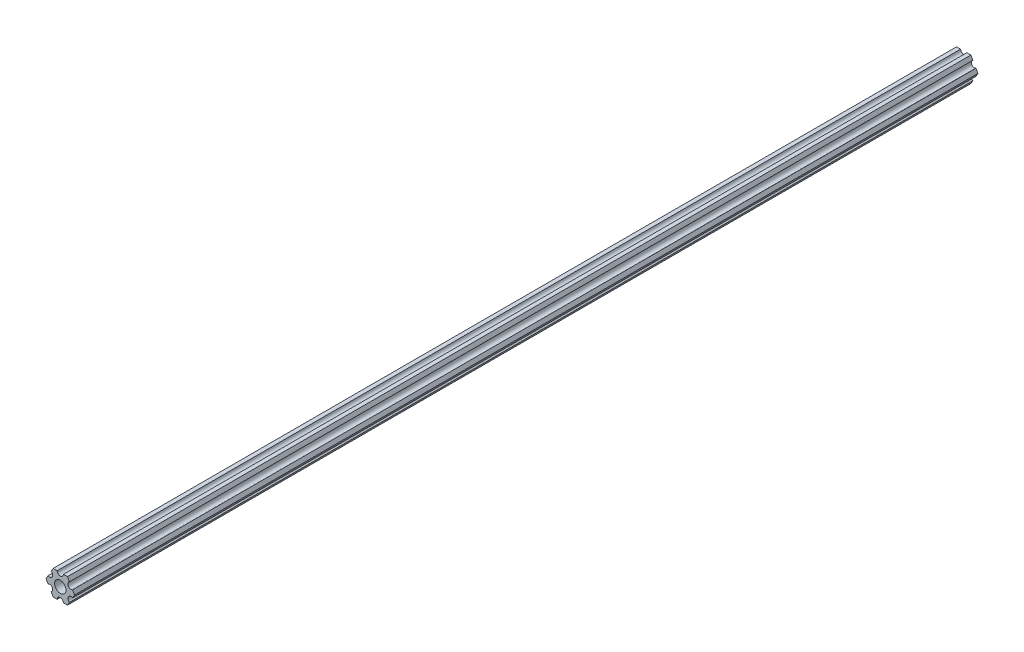
ISO-10303-21;
HEADER;
FILE_DESCRIPTION(('STEP AP214'),'2;1');
FILE_NAME('part.step','',(''),(''),'','','');
FILE_SCHEMA(('AUTOMOTIVE_DESIGN { 1 0 10303 214 1 1 1 1 }'));
ENDSEC;
DATA;
#1=APPLICATION_CONTEXT('core data for automotive mechanical design processes');
#2=APPLICATION_PROTOCOL_DEFINITION('international standard','automotive_design',2000,#1);
#3=PRODUCT_CONTEXT('',#1,'mechanical');
#4=PRODUCT('Part','Part','',(#3));
#5=PRODUCT_RELATED_PRODUCT_CATEGORY('part','',(#4));
#6=PRODUCT_DEFINITION_FORMATION('','',#4);
#7=PRODUCT_DEFINITION_CONTEXT('part definition',#1,'design');
#8=PRODUCT_DEFINITION('design','',#6,#7);
#9=PRODUCT_DEFINITION_SHAPE('','',#8);
#10=(LENGTH_UNIT() NAMED_UNIT(*) SI_UNIT(.MILLI.,.METRE.));
#11=(NAMED_UNIT(*) PLANE_ANGLE_UNIT() SI_UNIT($,.RADIAN.));
#12=(NAMED_UNIT(*) SI_UNIT($,.STERADIAN.) SOLID_ANGLE_UNIT());
#13=UNCERTAINTY_MEASURE_WITH_UNIT(LENGTH_MEASURE(1.E-05),#10,'distance_accuracy_value','');
#14=(GEOMETRIC_REPRESENTATION_CONTEXT(3) GLOBAL_UNCERTAINTY_ASSIGNED_CONTEXT((#13)) GLOBAL_UNIT_ASSIGNED_CONTEXT((#10,
#11,#12)) REPRESENTATION_CONTEXT('',''));
#15=CARTESIAN_POINT('',(0.,0.,0.));
#16=DIRECTION('',(0.,0.,1.));
#17=DIRECTION('',(1.,0.,0.));
#18=AXIS2_PLACEMENT_3D('',#15,#16,#17);
#19=CARTESIAN_POINT('',(5.49926112168156,3.17500033315933,231.775));
#20=DIRECTION('',(0.,0.,1.));
#21=DIRECTION('',(1.,0.,0.));
#22=AXIS2_PLACEMENT_3D('',#19,#20,#21);
#23=PLANE('',#22);
#24=DIRECTION('',(0.499999947533953,0.866025434075723,0.));
#25=VECTOR('',#24,1.);
#26=CARTESIAN_POINT('',(6.29301142309098,-1.80018429024546,231.775));
#27=LINE('',#26,#25);
#28=CARTESIAN_POINT('',(6.29301142309098,-1.80018429024546,231.775));
#29=VERTEX_POINT('',#28);
#30=CARTESIAN_POINT('',(7.33234841870826,4.44212519169686E-07,231.775));
#31=VERTEX_POINT('',#30);
#32=EDGE_CURVE('E256',#29,#31,#27,.T.);
#33=ORIENTED_EDGE('',*,*,#32,.T.);
#34=DIRECTION('',(-0.500000052466056,0.866025373493145,0.));
#35=VECTOR('',#34,1.);
#36=CARTESIAN_POINT('',(7.33234841870826,4.44212519169686E-07,231.775));
#37=LINE('',#36,#35);
#38=CARTESIAN_POINT('',(6.29301120497139,1.80018505273894,231.775));
#39=VERTEX_POINT('',#38);
#40=EDGE_CURVE('E132',#31,#39,#37,.T.);
#41=ORIENTED_EDGE('',*,*,#40,.T.);
#42=CARTESIAN_POINT('',(5.49926112168156,3.17500033315933,231.775));
#43=DIRECTION('',(0.,0.,-1.));
#44=DIRECTION('',(1.,0.,0.));
#45=AXIS2_PLACEMENT_3D('',#42,#43,#44);
#46=CIRCLE('',#45,1.5875);
#47=CARTESIAN_POINT('',(4.70551103839172,4.54981561357972,231.775));
#48=VERTEX_POINT('',#47);
#49=EDGE_CURVE('E317',#39,#48,#46,.T.);
#50=ORIENTED_EDGE('',*,*,#49,.T.);
#51=DIRECTION('',(-0.500000052466046,0.866025373493151,0.));
#52=VECTOR('',#51,1.);
#53=CARTESIAN_POINT('',(4.70551103839172,4.54981561357972,231.775));
#54=LINE('',#53,#52);
#55=CARTESIAN_POINT('',(3.66617382465481,6.35000022210627,231.775));
#56=VERTEX_POINT('',#55);
#57=EDGE_CURVE('E337',#48,#56,#54,.T.);
#58=ORIENTED_EDGE('',*,*,#57,.T.);
#59=DIRECTION('',(-0.999999999999998,-6.05825850611185E-08,0.));
#60=VECTOR('',#59,1.);
#61=CARTESIAN_POINT('',(3.66617382465481,6.35000022210627,231.775));
#62=LINE('',#61,#60);
#63=CARTESIAN_POINT('',(1.58749961530074,6.35000009617482,231.775));
#64=VERTEX_POINT('',#63);
#65=EDGE_CURVE('E333',#56,#64,#62,.T.);
#66=ORIENTED_EDGE('',*,*,#65,.T.);
#67=CARTESIAN_POINT('',(-3.84699260060323E-07,6.35,231.775));
#68=DIRECTION('',(0.,0.,-1.));
#69=DIRECTION('',(1.,0.,0.));
#70=AXIS2_PLACEMENT_3D('',#67,#68,#69);
#71=CIRCLE('',#70,1.5875);
#72=CARTESIAN_POINT('',(-1.58750038469926,6.34999990382518,231.775));
#73=VERTEX_POINT('',#72);
#74=EDGE_CURVE('E336',#64,#73,#71,.T.);
#75=ORIENTED_EDGE('',*,*,#74,.T.);
#76=DIRECTION('',(-0.999999999999998,-6.05825963273174E-08,0.));
#77=VECTOR('',#76,1.);
#78=CARTESIAN_POINT('',(-1.58750038469926,6.34999990382518,231.775));
#79=LINE('',#78,#77);
#80=CARTESIAN_POINT('',(-3.66617459405349,6.3499997778937,231.775));
#81=VERTEX_POINT('',#80);
#82=EDGE_CURVE('E341',#73,#81,#79,.T.);
#83=ORIENTED_EDGE('',*,*,#82,.T.);
#84=DIRECTION('',(-0.499999947533942,-0.866025434075729,0.));
#85=VECTOR('',#84,1.);
#86=CARTESIAN_POINT('',(-3.66617459405349,6.3499997778937,231.775));
#87=LINE('',#86,#85);
#88=CARTESIAN_POINT('',(-4.70551158967065,4.54981504343587,231.775));
#89=VERTEX_POINT('',#88);
#90=EDGE_CURVE('E348',#81,#89,#87,.T.);
#91=ORIENTED_EDGE('',*,*,#90,.T.);
#92=CARTESIAN_POINT('',(-5.49926150638082,3.17499966684067,231.775));
#93=DIRECTION('',(0.,0.,-1.));
#94=DIRECTION('',(1.,0.,0.));
#95=AXIS2_PLACEMENT_3D('',#92,#93,#94);
#96=CIRCLE('',#95,1.5875);
#97=CARTESIAN_POINT('',(-6.29301142309098,1.80018429024547,231.775));
#98=VERTEX_POINT('',#97);
#99=EDGE_CURVE('E351',#89,#98,#96,.T.);
#100=ORIENTED_EDGE('',*,*,#99,.T.);
#101=DIRECTION('',(-0.499999947533951,-0.866025434075724,0.));
#102=VECTOR('',#101,1.);
#103=CARTESIAN_POINT('',(-6.29301142309098,1.80018429024547,231.775));
#104=LINE('',#103,#102);
#105=CARTESIAN_POINT('',(-7.33234841870826,-4.44212523790841E-07,231.775));
#106=VERTEX_POINT('',#105);
#107=EDGE_CURVE('E354',#98,#106,#104,.T.);
#108=ORIENTED_EDGE('',*,*,#107,.T.);
#109=DIRECTION('',(0.500000052466045,-0.866025373493151,0.));
#110=VECTOR('',#109,1.);
#111=CARTESIAN_POINT('',(-7.33234841870826,-4.44212523790841E-07,231.775));
#112=LINE('',#111,#110);
#113=CARTESIAN_POINT('',(-6.29301120497141,-1.80018505273897,231.775));
#114=VERTEX_POINT('',#113);
#115=EDGE_CURVE('E357',#106,#114,#112,.T.);
#116=ORIENTED_EDGE('',*,*,#115,.T.);
#117=CARTESIAN_POINT('',(-5.49926112168156,-3.17500033315934,231.775));
#118=DIRECTION('',(0.,0.,-1.));
#119=DIRECTION('',(1.,0.,0.));
#120=AXIS2_PLACEMENT_3D('',#117,#118,#119);
#121=CIRCLE('',#120,1.5875);
#122=CARTESIAN_POINT('',(-4.70551103839172,-4.54981561357972,231.775));
#123=VERTEX_POINT('',#122);
#124=EDGE_CURVE('E360',#114,#123,#121,.T.);
#125=ORIENTED_EDGE('',*,*,#124,.T.);
#126=DIRECTION('',(0.500000052466045,-0.866025373493151,0.));
#127=VECTOR('',#126,1.);
#128=CARTESIAN_POINT('',(-4.70551103839172,-4.54981561357972,231.775));
#129=LINE('',#128,#127);
#130=CARTESIAN_POINT('',(-3.66617382465481,-6.35000022210628,231.775));
#131=VERTEX_POINT('',#130);
#132=EDGE_CURVE('E363',#123,#131,#129,.T.);
#133=ORIENTED_EDGE('',*,*,#132,.T.);
#134=DIRECTION('',(0.999999999999998,6.05825854783851E-08,0.));
#135=VECTOR('',#134,1.);
#136=CARTESIAN_POINT('',(-3.66617382465481,-6.35000022210628,231.775));
#137=LINE('',#136,#135);
#138=CARTESIAN_POINT('',(-1.58749961530074,-6.35000009617482,231.775));
#139=VERTEX_POINT('',#138);
#140=EDGE_CURVE('E366',#131,#139,#137,.T.);
#141=ORIENTED_EDGE('',*,*,#140,.T.);
#142=CARTESIAN_POINT('',(3.8469926204343E-07,-6.35,231.775));
#143=DIRECTION('',(0.,0.,-1.));
#144=DIRECTION('',(1.,0.,0.));
#145=AXIS2_PLACEMENT_3D('',#142,#143,#144);
#146=CIRCLE('',#145,1.5875);
#147=CARTESIAN_POINT('',(1.58750038469926,-6.34999990382518,231.775));
#148=VERTEX_POINT('',#147);
#149=EDGE_CURVE('E181',#139,#148,#146,.T.);
#150=ORIENTED_EDGE('',*,*,#149,.T.);
#151=DIRECTION('',(0.999999999999998,6.05825721258438E-08,0.));
#152=VECTOR('',#151,1.);
#153=CARTESIAN_POINT('',(1.58750038469926,-6.34999990382518,231.775));
#154=LINE('',#153,#152);
#155=CARTESIAN_POINT('',(3.66617459405346,-6.34999977789375,231.775));
#156=VERTEX_POINT('',#155);
#157=EDGE_CURVE('E175',#148,#156,#154,.T.);
#158=ORIENTED_EDGE('',*,*,#157,.T.);
#159=DIRECTION('',(0.499999947533941,0.86602543407573,0.));
#160=VECTOR('',#159,1.);
#161=CARTESIAN_POINT('',(3.66617459405346,-6.34999977789375,231.775));
#162=LINE('',#161,#160);
#163=CARTESIAN_POINT('',(4.70551158967065,-4.54981504343587,231.775));
#164=VERTEX_POINT('',#163);
#165=EDGE_CURVE('E179',#156,#164,#162,.T.);
#166=ORIENTED_EDGE('',*,*,#165,.T.);
#167=CARTESIAN_POINT('',(5.49926150638082,-3.17499966684067,231.775));
#168=DIRECTION('',(0.,0.,-1.));
#169=DIRECTION('',(1.,0.,0.));
#170=AXIS2_PLACEMENT_3D('',#167,#168,#169);
#171=CIRCLE('',#170,1.58750000000001);
#172=EDGE_CURVE('E59',#164,#29,#171,.T.);
#173=ORIENTED_EDGE('',*,*,#172,.T.);
#174=EDGE_LOOP('',(#33,#41,#50,#58,#66,#75,#83,#91,#100,#108,#116,#125,#133,#141,#150,#158,#166,#173));
#175=FACE_BOUND('',#174,.T.);
#176=CARTESIAN_POINT('',(0.,0.,231.775));
#177=DIRECTION('',(0.,0.,1.));
#178=DIRECTION('',(1.,0.,0.));
#179=AXIS2_PLACEMENT_3D('',#176,#177,#178);
#180=CIRCLE('',#179,2.9337);
#181=CARTESIAN_POINT('',(2.9337,0.,231.775));
#182=VERTEX_POINT('',#181);
#183=EDGE_CURVE('E208',#182,#182,#180,.T.);
#184=ORIENTED_EDGE('',*,*,#183,.F.);
#185=EDGE_LOOP('',(#184));
#186=FACE_BOUND('',#185,.T.);
#187=ADVANCED_FACE('F41',(#175,#186),#23,.T.);
#188=CARTESIAN_POINT('',(5.49926112168156,3.17500033315933,-231.775));
#189=DIRECTION('',(0.,0.,1.));
#190=DIRECTION('',(1.,0.,0.));
#191=AXIS2_PLACEMENT_3D('',#188,#189,#190);
#192=PLANE('',#191);
#193=DIRECTION('',(0.499999947533953,0.866025434075723,0.));
#194=VECTOR('',#193,1.);
#195=CARTESIAN_POINT('',(6.29301142309098,-1.80018429024546,-231.775));
#196=LINE('',#195,#194);
#197=CARTESIAN_POINT('',(6.29301142309098,-1.80018429024546,-231.775));
#198=VERTEX_POINT('',#197);
#199=CARTESIAN_POINT('',(7.33234841870826,4.44212519169686E-07,-231.775));
#200=VERTEX_POINT('',#199);
#201=EDGE_CURVE('E203',#198,#200,#196,.T.);
#202=ORIENTED_EDGE('',*,*,#201,.F.);
#203=CARTESIAN_POINT('',(5.49926150638082,-3.17499966684067,-231.775));
#204=DIRECTION('',(0.,0.,-1.));
#205=DIRECTION('',(1.,0.,0.));
#206=AXIS2_PLACEMENT_3D('',#203,#204,#205);
#207=CIRCLE('',#206,1.58750000000001);
#208=CARTESIAN_POINT('',(4.70551158967065,-4.54981504343587,-231.775));
#209=VERTEX_POINT('',#208);
#210=EDGE_CURVE('E124',#209,#198,#207,.T.);
#211=ORIENTED_EDGE('',*,*,#210,.F.);
#212=DIRECTION('',(0.499999947533941,0.86602543407573,0.));
#213=VECTOR('',#212,1.);
#214=CARTESIAN_POINT('',(3.66617459405346,-6.34999977789375,-231.775));
#215=LINE('',#214,#213);
#216=CARTESIAN_POINT('',(3.66617459405346,-6.34999977789375,-231.775));
#217=VERTEX_POINT('',#216);
#218=EDGE_CURVE('E118',#217,#209,#215,.T.);
#219=ORIENTED_EDGE('',*,*,#218,.F.);
#220=DIRECTION('',(0.999999999999998,6.05825721258438E-08,0.));
#221=VECTOR('',#220,1.);
#222=CARTESIAN_POINT('',(1.58750038469926,-6.34999990382518,-231.775));
#223=LINE('',#222,#221);
#224=CARTESIAN_POINT('',(1.58750038469926,-6.34999990382518,-231.775));
#225=VERTEX_POINT('',#224);
#226=EDGE_CURVE('E190',#225,#217,#223,.T.);
#227=ORIENTED_EDGE('',*,*,#226,.F.);
#228=CARTESIAN_POINT('',(3.8469926204343E-07,-6.35,-231.775));
#229=DIRECTION('',(0.,0.,-1.));
#230=DIRECTION('',(1.,0.,0.));
#231=AXIS2_PLACEMENT_3D('',#228,#229,#230);
#232=CIRCLE('',#231,1.5875);
#233=CARTESIAN_POINT('',(-1.58749961530074,-6.35000009617482,-231.775));
#234=VERTEX_POINT('',#233);
#235=EDGE_CURVE('E247',#234,#225,#232,.T.);
#236=ORIENTED_EDGE('',*,*,#235,.F.);
#237=DIRECTION('',(0.999999999999998,6.05825854783851E-08,0.));
#238=VECTOR('',#237,1.);
#239=CARTESIAN_POINT('',(-3.66617382465481,-6.35000022210628,-231.775));
#240=LINE('',#239,#238);
#241=CARTESIAN_POINT('',(-3.66617382465481,-6.35000022210628,-231.775));
#242=VERTEX_POINT('',#241);
#243=EDGE_CURVE('E244',#242,#234,#240,.T.);
#244=ORIENTED_EDGE('',*,*,#243,.F.);
#245=DIRECTION('',(0.500000052466045,-0.866025373493151,0.));
#246=VECTOR('',#245,1.);
#247=CARTESIAN_POINT('',(-4.70551103839172,-4.54981561357972,-231.775));
#248=LINE('',#247,#246);
#249=CARTESIAN_POINT('',(-4.70551103839172,-4.54981561357972,-231.775));
#250=VERTEX_POINT('',#249);
#251=EDGE_CURVE('E241',#250,#242,#248,.T.);
#252=ORIENTED_EDGE('',*,*,#251,.F.);
#253=CARTESIAN_POINT('',(-5.49926112168156,-3.17500033315934,-231.775));
#254=DIRECTION('',(0.,0.,-1.));
#255=DIRECTION('',(1.,0.,0.));
#256=AXIS2_PLACEMENT_3D('',#253,#254,#255);
#257=CIRCLE('',#256,1.5875);
#258=CARTESIAN_POINT('',(-6.29301120497141,-1.80018505273897,-231.775));
#259=VERTEX_POINT('',#258);
#260=EDGE_CURVE('E238',#259,#250,#257,.T.);
#261=ORIENTED_EDGE('',*,*,#260,.F.);
#262=DIRECTION('',(0.500000052466045,-0.866025373493151,0.));
#263=VECTOR('',#262,1.);
#264=CARTESIAN_POINT('',(-7.33234841870826,-4.44212523790841E-07,-231.775));
#265=LINE('',#264,#263);
#266=CARTESIAN_POINT('',(-7.33234841870826,-4.44212523790841E-07,-231.775));
#267=VERTEX_POINT('',#266);
#268=EDGE_CURVE('E235',#267,#259,#265,.T.);
#269=ORIENTED_EDGE('',*,*,#268,.F.);
#270=DIRECTION('',(-0.499999947533951,-0.866025434075724,0.));
#271=VECTOR('',#270,1.);
#272=CARTESIAN_POINT('',(-6.29301142309098,1.80018429024547,-231.775));
#273=LINE('',#272,#271);
#274=CARTESIAN_POINT('',(-6.29301142309098,1.80018429024547,-231.775));
#275=VERTEX_POINT('',#274);
#276=EDGE_CURVE('E232',#275,#267,#273,.T.);
#277=ORIENTED_EDGE('',*,*,#276,.F.);
#278=CARTESIAN_POINT('',(-5.49926150638082,3.17499966684067,-231.775));
#279=DIRECTION('',(0.,0.,-1.));
#280=DIRECTION('',(1.,0.,0.));
#281=AXIS2_PLACEMENT_3D('',#278,#279,#280);
#282=CIRCLE('',#281,1.5875);
#283=CARTESIAN_POINT('',(-4.70551158967065,4.54981504343587,-231.775));
#284=VERTEX_POINT('',#283);
#285=EDGE_CURVE('E229',#284,#275,#282,.T.);
#286=ORIENTED_EDGE('',*,*,#285,.F.);
#287=DIRECTION('',(-0.499999947533942,-0.866025434075729,0.));
#288=VECTOR('',#287,1.);
#289=CARTESIAN_POINT('',(-3.66617459405349,6.3499997778937,-231.775));
#290=LINE('',#289,#288);
#291=CARTESIAN_POINT('',(-3.66617459405349,6.3499997778937,-231.775));
#292=VERTEX_POINT('',#291);
#293=EDGE_CURVE('E226',#292,#284,#290,.T.);
#294=ORIENTED_EDGE('',*,*,#293,.F.);
#295=DIRECTION('',(-0.999999999999998,-6.05825963273174E-08,0.));
#296=VECTOR('',#295,1.);
#297=CARTESIAN_POINT('',(-1.58750038469926,6.34999990382518,-231.775));
#298=LINE('',#297,#296);
#299=CARTESIAN_POINT('',(-1.58750038469926,6.34999990382518,-231.775));
#300=VERTEX_POINT('',#299);
#301=EDGE_CURVE('E223',#300,#292,#298,.T.);
#302=ORIENTED_EDGE('',*,*,#301,.F.);
#303=CARTESIAN_POINT('',(-3.84699260060323E-07,6.35,-231.775));
#304=DIRECTION('',(0.,0.,-1.));
#305=DIRECTION('',(1.,0.,0.));
#306=AXIS2_PLACEMENT_3D('',#303,#304,#305);
#307=CIRCLE('',#306,1.5875);
#308=CARTESIAN_POINT('',(1.58749961530074,6.35000009617482,-231.775));
#309=VERTEX_POINT('',#308);
#310=EDGE_CURVE('E220',#309,#300,#307,.T.);
#311=ORIENTED_EDGE('',*,*,#310,.F.);
#312=DIRECTION('',(-0.999999999999998,-6.05825850611185E-08,0.));
#313=VECTOR('',#312,1.);
#314=CARTESIAN_POINT('',(3.66617382465481,6.35000022210627,-231.775));
#315=LINE('',#314,#313);
#316=CARTESIAN_POINT('',(3.66617382465481,6.35000022210627,-231.775));
#317=VERTEX_POINT('',#316);
#318=EDGE_CURVE('E217',#317,#309,#315,.T.);
#319=ORIENTED_EDGE('',*,*,#318,.F.);
#320=DIRECTION('',(-0.500000052466046,0.866025373493151,0.));
#321=VECTOR('',#320,1.);
#322=CARTESIAN_POINT('',(4.70551103839172,4.54981561357972,-231.775));
#323=LINE('',#322,#321);
#324=CARTESIAN_POINT('',(4.70551103839172,4.54981561357972,-231.775));
#325=VERTEX_POINT('',#324);
#326=EDGE_CURVE('E214',#325,#317,#323,.T.);
#327=ORIENTED_EDGE('',*,*,#326,.F.);
#328=CARTESIAN_POINT('',(5.49926112168156,3.17500033315933,-231.775));
#329=DIRECTION('',(0.,0.,-1.));
#330=DIRECTION('',(1.,0.,0.));
#331=AXIS2_PLACEMENT_3D('',#328,#329,#330);
#332=CIRCLE('',#331,1.5875);
#333=CARTESIAN_POINT('',(6.29301120497139,1.80018505273894,-231.775));
#334=VERTEX_POINT('',#333);
#335=EDGE_CURVE('E211',#334,#325,#332,.T.);
#336=ORIENTED_EDGE('',*,*,#335,.F.);
#337=DIRECTION('',(-0.500000052466056,0.866025373493145,0.));
#338=VECTOR('',#337,1.);
#339=CARTESIAN_POINT('',(7.33234841870826,4.44212519169686E-07,-231.775));
#340=LINE('',#339,#338);
#341=EDGE_CURVE('E207',#200,#334,#340,.T.);
#342=ORIENTED_EDGE('',*,*,#341,.F.);
#343=EDGE_LOOP('',(#202,#211,#219,#227,#236,#244,#252,#261,#269,#277,#286,#294,#302,#311,#319,
#327,#336,#342));
#344=FACE_BOUND('',#343,.T.);
#345=CARTESIAN_POINT('',(0.,0.,-231.775));
#346=DIRECTION('',(0.,0.,1.));
#347=DIRECTION('',(1.,0.,0.));
#348=AXIS2_PLACEMENT_3D('',#345,#346,#347);
#349=CIRCLE('',#348,2.9337);
#350=CARTESIAN_POINT('',(2.9337,0.,-231.775));
#351=VERTEX_POINT('',#350);
#352=EDGE_CURVE('E593',#351,#351,#349,.T.);
#353=ORIENTED_EDGE('',*,*,#352,.T.);
#354=EDGE_LOOP('',(#353));
#355=FACE_BOUND('',#354,.T.);
#356=ADVANCED_FACE('F321',(#344,#355),#192,.F.);
#357=CARTESIAN_POINT('',(6.29301142309098,-1.80018429024546,231.775));
#358=DIRECTION('',(-0.866025434075723,0.499999947533953,0.));
#359=DIRECTION('',(-0.499999947533953,-0.866025434075723,0.));
#360=AXIS2_PLACEMENT_3D('',#357,#358,#359);
#361=PLANE('',#360);
#362=ORIENTED_EDGE('',*,*,#201,.T.);
#363=DIRECTION('',(0.,0.,-1.));
#364=VECTOR('',#363,1.);
#365=CARTESIAN_POINT('',(7.33234841870826,4.44212519169686E-07,231.775));
#366=LINE('',#365,#364);
#367=EDGE_CURVE('E11',#31,#200,#366,.T.);
#368=ORIENTED_EDGE('',*,*,#367,.F.);
#369=ORIENTED_EDGE('',*,*,#32,.F.);
#370=DIRECTION('',(0.,0.,-1.));
#371=VECTOR('',#370,1.);
#372=CARTESIAN_POINT('',(6.29301142309098,-1.80018429024546,231.775));
#373=LINE('',#372,#371);
#374=EDGE_CURVE('E199',#29,#198,#373,.T.);
#375=ORIENTED_EDGE('',*,*,#374,.T.);
#376=EDGE_LOOP('',(#362,#368,#369,#375));
#377=FACE_BOUND('',#376,.T.);
#378=ADVANCED_FACE('F43',(#377),#361,.F.);
#379=CARTESIAN_POINT('',(7.33234841870826,4.44212519169686E-07,231.775));
#380=DIRECTION('',(-0.866025373493145,-0.500000052466056,0.));
#381=DIRECTION('',(0.500000052466057,-0.866025373493145,0.));
#382=AXIS2_PLACEMENT_3D('',#379,#380,#381);
#383=PLANE('',#382);
#384=ORIENTED_EDGE('',*,*,#341,.T.);
#385=DIRECTION('',(0.,0.,-1.));
#386=VECTOR('',#385,1.);
#387=CARTESIAN_POINT('',(6.29301120497139,1.80018505273894,231.775));
#388=LINE('',#387,#386);
#389=EDGE_CURVE('E51',#39,#334,#388,.T.);
#390=ORIENTED_EDGE('',*,*,#389,.F.);
#391=ORIENTED_EDGE('',*,*,#40,.F.);
#392=ORIENTED_EDGE('',*,*,#367,.T.);
#393=EDGE_LOOP('',(#384,#390,#391,#392));
#394=FACE_BOUND('',#393,.T.);
#395=ADVANCED_FACE('F402',(#394),#383,.F.);
#396=CARTESIAN_POINT('',(5.49926112168156,3.17500033315933,231.775));
#397=DIRECTION('',(0.,0.,-1.));
#398=DIRECTION('',(-1.,0.,0.));
#399=AXIS2_PLACEMENT_3D('',#396,#397,#398);
#400=CYLINDRICAL_SURFACE('',#399,1.5875);
#401=ORIENTED_EDGE('',*,*,#335,.T.);
#402=DIRECTION('',(0.,0.,-1.));
#403=VECTOR('',#402,1.);
#404=CARTESIAN_POINT('',(4.70551103839172,4.54981561357972,231.775));
#405=LINE('',#404,#403);
#406=EDGE_CURVE('E307',#48,#325,#405,.T.);
#407=ORIENTED_EDGE('',*,*,#406,.F.);
#408=ORIENTED_EDGE('',*,*,#49,.F.);
#409=ORIENTED_EDGE('',*,*,#389,.T.);
#410=EDGE_LOOP('',(#401,#407,#408,#409));
#411=FACE_BOUND('',#410,.T.);
#412=ADVANCED_FACE('F315',(#411),#400,.F.);
#413=CARTESIAN_POINT('',(4.70551103839172,4.54981561357972,231.775));
#414=DIRECTION('',(-0.866025373493151,-0.500000052466046,0.));
#415=DIRECTION('',(0.500000052466046,-0.866025373493151,0.));
#416=AXIS2_PLACEMENT_3D('',#413,#414,#415);
#417=PLANE('',#416);
#418=ORIENTED_EDGE('',*,*,#326,.T.);
#419=DIRECTION('',(0.,0.,-1.));
#420=VECTOR('',#419,1.);
#421=CARTESIAN_POINT('',(3.66617382465481,6.35000022210627,231.775));
#422=LINE('',#421,#420);
#423=EDGE_CURVE('E303',#56,#317,#422,.T.);
#424=ORIENTED_EDGE('',*,*,#423,.F.);
#425=ORIENTED_EDGE('',*,*,#57,.F.);
#426=ORIENTED_EDGE('',*,*,#406,.T.);
#427=EDGE_LOOP('',(#418,#424,#425,#426));
#428=FACE_BOUND('',#427,.T.);
#429=ADVANCED_FACE('F327',(#428),#417,.F.);
#430=CARTESIAN_POINT('',(3.66617382465481,6.35000022210627,231.775));
#431=DIRECTION('',(6.05825850611185E-08,-0.999999999999998,0.));
#432=DIRECTION('',(0.999999999999998,6.05825850611185E-08,0.));
#433=AXIS2_PLACEMENT_3D('',#430,#431,#432);
#434=PLANE('',#433);
#435=ORIENTED_EDGE('',*,*,#318,.T.);
#436=DIRECTION('',(0.,0.,-1.));
#437=VECTOR('',#436,1.);
#438=CARTESIAN_POINT('',(1.58749961530074,6.35000009617482,231.775));
#439=LINE('',#438,#437);
#440=EDGE_CURVE('E299',#64,#309,#439,.T.);
#441=ORIENTED_EDGE('',*,*,#440,.F.);
#442=ORIENTED_EDGE('',*,*,#65,.F.);
#443=ORIENTED_EDGE('',*,*,#423,.T.);
#444=EDGE_LOOP('',(#435,#441,#442,#443));
#445=FACE_BOUND('',#444,.T.);
#446=ADVANCED_FACE('F331',(#445),#434,.F.);
#447=CARTESIAN_POINT('',(-3.84699260060323E-07,6.35,231.775));
#448=DIRECTION('',(0.,0.,-1.));
#449=DIRECTION('',(-1.,0.,0.));
#450=AXIS2_PLACEMENT_3D('',#447,#448,#449);
#451=CYLINDRICAL_SURFACE('',#450,1.5875);
#452=ORIENTED_EDGE('',*,*,#310,.T.);
#453=DIRECTION('',(0.,0.,-1.));
#454=VECTOR('',#453,1.);
#455=CARTESIAN_POINT('',(-1.58750038469926,6.34999990382518,231.775));
#456=LINE('',#455,#454);
#457=EDGE_CURVE('E295',#73,#300,#456,.T.);
#458=ORIENTED_EDGE('',*,*,#457,.F.);
#459=ORIENTED_EDGE('',*,*,#74,.F.);
#460=ORIENTED_EDGE('',*,*,#440,.T.);
#461=EDGE_LOOP('',(#452,#458,#459,#460));
#462=FACE_BOUND('',#461,.T.);
#463=ADVANCED_FACE('F415',(#462),#451,.F.);
#464=CARTESIAN_POINT('',(-1.58750038469926,6.34999990382518,231.775));
#465=DIRECTION('',(6.05825963273174E-08,-0.999999999999998,0.));
#466=DIRECTION('',(0.999999999999998,6.05825963273174E-08,0.));
#467=AXIS2_PLACEMENT_3D('',#464,#465,#466);
#468=PLANE('',#467);
#469=ORIENTED_EDGE('',*,*,#301,.T.);
#470=DIRECTION('',(0.,0.,-1.));
#471=VECTOR('',#470,1.);
#472=CARTESIAN_POINT('',(-3.66617459405349,6.3499997778937,231.775));
#473=LINE('',#472,#471);
#474=EDGE_CURVE('E291',#81,#292,#473,.T.);
#475=ORIENTED_EDGE('',*,*,#474,.F.);
#476=ORIENTED_EDGE('',*,*,#82,.F.);
#477=ORIENTED_EDGE('',*,*,#457,.T.);
#478=EDGE_LOOP('',(#469,#475,#476,#477));
#479=FACE_BOUND('',#478,.T.);
#480=ADVANCED_FACE('F418',(#479),#468,.F.);
#481=CARTESIAN_POINT('',(-3.66617459405349,6.3499997778937,231.775));
#482=DIRECTION('',(0.866025434075729,-0.499999947533943,0.));
#483=DIRECTION('',(0.499999947533943,0.866025434075729,0.));
#484=AXIS2_PLACEMENT_3D('',#481,#482,#483);
#485=PLANE('',#484);
#486=ORIENTED_EDGE('',*,*,#293,.T.);
#487=DIRECTION('',(0.,0.,-1.));
#488=VECTOR('',#487,1.);
#489=CARTESIAN_POINT('',(-4.70551158967065,4.54981504343587,231.775));
#490=LINE('',#489,#488);
#491=EDGE_CURVE('E287',#89,#284,#490,.T.);
#492=ORIENTED_EDGE('',*,*,#491,.F.);
#493=ORIENTED_EDGE('',*,*,#90,.F.);
#494=ORIENTED_EDGE('',*,*,#474,.T.);
#495=EDGE_LOOP('',(#486,#492,#493,#494));
#496=FACE_BOUND('',#495,.T.);
#497=ADVANCED_FACE('F422',(#496),#485,.F.);
#498=CARTESIAN_POINT('',(-5.49926150638082,3.17499966684067,231.775));
#499=DIRECTION('',(0.,0.,-1.));
#500=DIRECTION('',(-1.,0.,0.));
#501=AXIS2_PLACEMENT_3D('',#498,#499,#500);
#502=CYLINDRICAL_SURFACE('',#501,1.5875);
#503=ORIENTED_EDGE('',*,*,#285,.T.);
#504=DIRECTION('',(0.,0.,-1.));
#505=VECTOR('',#504,1.);
#506=CARTESIAN_POINT('',(-6.29301142309098,1.80018429024547,231.775));
#507=LINE('',#506,#505);
#508=EDGE_CURVE('E283',#98,#275,#507,.T.);
#509=ORIENTED_EDGE('',*,*,#508,.F.);
#510=ORIENTED_EDGE('',*,*,#99,.F.);
#511=ORIENTED_EDGE('',*,*,#491,.T.);
#512=EDGE_LOOP('',(#503,#509,#510,#511));
#513=FACE_BOUND('',#512,.T.);
#514=ADVANCED_FACE('F426',(#513),#502,.F.);
#515=CARTESIAN_POINT('',(-6.29301142309098,1.80018429024547,231.775));
#516=DIRECTION('',(0.866025434075724,-0.499999947533951,0.));
#517=DIRECTION('',(0.499999947533951,0.866025434075724,0.));
#518=AXIS2_PLACEMENT_3D('',#515,#516,#517);
#519=PLANE('',#518);
#520=ORIENTED_EDGE('',*,*,#276,.T.);
#521=DIRECTION('',(0.,0.,-1.));
#522=VECTOR('',#521,1.);
#523=CARTESIAN_POINT('',(-7.33234841870826,-4.44212523790841E-07,231.775));
#524=LINE('',#523,#522);
#525=EDGE_CURVE('E279',#106,#267,#524,.T.);
#526=ORIENTED_EDGE('',*,*,#525,.F.);
#527=ORIENTED_EDGE('',*,*,#107,.F.);
#528=ORIENTED_EDGE('',*,*,#508,.T.);
#529=EDGE_LOOP('',(#520,#526,#527,#528));
#530=FACE_BOUND('',#529,.T.);
#531=ADVANCED_FACE('F430',(#530),#519,.F.);
#532=CARTESIAN_POINT('',(-7.33234841870826,-4.44212523790841E-07,231.775));
#533=DIRECTION('',(0.866025373493151,0.500000052466045,0.));
#534=DIRECTION('',(-0.500000052466045,0.866025373493151,0.));
#535=AXIS2_PLACEMENT_3D('',#532,#533,#534);
#536=PLANE('',#535);
#537=ORIENTED_EDGE('',*,*,#268,.T.);
#538=DIRECTION('',(0.,0.,-1.));
#539=VECTOR('',#538,1.);
#540=CARTESIAN_POINT('',(-6.29301120497141,-1.80018505273897,231.775));
#541=LINE('',#540,#539);
#542=EDGE_CURVE('E275',#114,#259,#541,.T.);
#543=ORIENTED_EDGE('',*,*,#542,.F.);
#544=ORIENTED_EDGE('',*,*,#115,.F.);
#545=ORIENTED_EDGE('',*,*,#525,.T.);
#546=EDGE_LOOP('',(#537,#543,#544,#545));
#547=FACE_BOUND('',#546,.T.);
#548=ADVANCED_FACE('F434',(#547),#536,.F.);
#549=CARTESIAN_POINT('',(-5.49926112168156,-3.17500033315934,231.775));
#550=DIRECTION('',(0.,0.,-1.));
#551=DIRECTION('',(-1.,0.,0.));
#552=AXIS2_PLACEMENT_3D('',#549,#550,#551);
#553=CYLINDRICAL_SURFACE('',#552,1.5875);
#554=ORIENTED_EDGE('',*,*,#260,.T.);
#555=DIRECTION('',(0.,0.,-1.));
#556=VECTOR('',#555,1.);
#557=CARTESIAN_POINT('',(-4.70551103839172,-4.54981561357972,231.775));
#558=LINE('',#557,#556);
#559=EDGE_CURVE('E271',#123,#250,#558,.T.);
#560=ORIENTED_EDGE('',*,*,#559,.F.);
#561=ORIENTED_EDGE('',*,*,#124,.F.);
#562=ORIENTED_EDGE('',*,*,#542,.T.);
#563=EDGE_LOOP('',(#554,#560,#561,#562));
#564=FACE_BOUND('',#563,.T.);
#565=ADVANCED_FACE('F438',(#564),#553,.F.);
#566=CARTESIAN_POINT('',(-4.70551103839172,-4.54981561357972,231.775));
#567=DIRECTION('',(0.866025373493151,0.500000052466045,0.));
#568=DIRECTION('',(-0.500000052466045,0.866025373493151,0.));
#569=AXIS2_PLACEMENT_3D('',#566,#567,#568);
#570=PLANE('',#569);
#571=ORIENTED_EDGE('',*,*,#251,.T.);
#572=DIRECTION('',(0.,0.,-1.));
#573=VECTOR('',#572,1.);
#574=CARTESIAN_POINT('',(-3.66617382465481,-6.35000022210628,231.775));
#575=LINE('',#574,#573);
#576=EDGE_CURVE('E267',#131,#242,#575,.T.);
#577=ORIENTED_EDGE('',*,*,#576,.F.);
#578=ORIENTED_EDGE('',*,*,#132,.F.);
#579=ORIENTED_EDGE('',*,*,#559,.T.);
#580=EDGE_LOOP('',(#571,#577,#578,#579));
#581=FACE_BOUND('',#580,.T.);
#582=ADVANCED_FACE('F442',(#581),#570,.F.);
#583=CARTESIAN_POINT('',(-3.66617382465481,-6.35000022210628,231.775));
#584=DIRECTION('',(-6.05825854783851E-08,0.999999999999998,0.));
#585=DIRECTION('',(-0.999999999999998,-6.05825854783851E-08,0.));
#586=AXIS2_PLACEMENT_3D('',#583,#584,#585);
#587=PLANE('',#586);
#588=ORIENTED_EDGE('',*,*,#243,.T.);
#589=DIRECTION('',(0.,0.,-1.));
#590=VECTOR('',#589,1.);
#591=CARTESIAN_POINT('',(-1.58749961530074,-6.35000009617482,231.775));
#592=LINE('',#591,#590);
#593=EDGE_CURVE('E263',#139,#234,#592,.T.);
#594=ORIENTED_EDGE('',*,*,#593,.F.);
#595=ORIENTED_EDGE('',*,*,#140,.F.);
#596=ORIENTED_EDGE('',*,*,#576,.T.);
#597=EDGE_LOOP('',(#588,#594,#595,#596));
#598=FACE_BOUND('',#597,.T.);
#599=ADVANCED_FACE('F374',(#598),#587,.F.);
#600=CARTESIAN_POINT('',(3.8469926204343E-07,-6.35,231.775));
#601=DIRECTION('',(0.,0.,-1.));
#602=DIRECTION('',(-1.,0.,0.));
#603=AXIS2_PLACEMENT_3D('',#600,#601,#602);
#604=CYLINDRICAL_SURFACE('',#603,1.5875);
#605=ORIENTED_EDGE('',*,*,#235,.T.);
#606=DIRECTION('',(0.,0.,-1.));
#607=VECTOR('',#606,1.);
#608=CARTESIAN_POINT('',(1.58750038469926,-6.34999990382518,231.775));
#609=LINE('',#608,#607);
#610=EDGE_CURVE('E192',#148,#225,#609,.T.);
#611=ORIENTED_EDGE('',*,*,#610,.F.);
#612=ORIENTED_EDGE('',*,*,#149,.F.);
#613=ORIENTED_EDGE('',*,*,#593,.T.);
#614=EDGE_LOOP('',(#605,#611,#612,#613));
#615=FACE_BOUND('',#614,.T.);
#616=ADVANCED_FACE('F378',(#615),#604,.F.);
#617=CARTESIAN_POINT('',(1.58750038469926,-6.34999990382518,231.775));
#618=DIRECTION('',(-6.05825721258438E-08,0.999999999999998,0.));
#619=DIRECTION('',(-0.999999999999998,-6.05825721258438E-08,0.));
#620=AXIS2_PLACEMENT_3D('',#617,#618,#619);
#621=PLANE('',#620);
#622=ORIENTED_EDGE('',*,*,#226,.T.);
#623=DIRECTION('',(0.,0.,-1.));
#624=VECTOR('',#623,1.);
#625=CARTESIAN_POINT('',(3.66617459405346,-6.34999977789375,231.775));
#626=LINE('',#625,#624);
#627=EDGE_CURVE('E187',#156,#217,#626,.T.);
#628=ORIENTED_EDGE('',*,*,#627,.F.);
#629=ORIENTED_EDGE('',*,*,#157,.F.);
#630=ORIENTED_EDGE('',*,*,#610,.T.);
#631=EDGE_LOOP('',(#622,#628,#629,#630));
#632=FACE_BOUND('',#631,.T.);
#633=ADVANCED_FACE('F188',(#632),#621,.F.);
#634=CARTESIAN_POINT('',(3.66617459405346,-6.34999977789375,231.775));
#635=DIRECTION('',(-0.86602543407573,0.499999947533941,0.));
#636=DIRECTION('',(-0.499999947533941,-0.86602543407573,0.));
#637=AXIS2_PLACEMENT_3D('',#634,#635,#636);
#638=PLANE('',#637);
#639=ORIENTED_EDGE('',*,*,#218,.T.);
#640=DIRECTION('',(0.,0.,-1.));
#641=VECTOR('',#640,1.);
#642=CARTESIAN_POINT('',(4.70551158967065,-4.54981504343587,231.775));
#643=LINE('',#642,#641);
#644=EDGE_CURVE('E193',#164,#209,#643,.T.);
#645=ORIENTED_EDGE('',*,*,#644,.F.);
#646=ORIENTED_EDGE('',*,*,#165,.F.);
#647=ORIENTED_EDGE('',*,*,#627,.T.);
#648=EDGE_LOOP('',(#639,#645,#646,#647));
#649=FACE_BOUND('',#648,.T.);
#650=ADVANCED_FACE('F195',(#649),#638,.F.);
#651=CARTESIAN_POINT('',(5.49926150638082,-3.17499966684067,231.775));
#652=DIRECTION('',(0.,0.,-1.));
#653=DIRECTION('',(-1.,0.,0.));
#654=AXIS2_PLACEMENT_3D('',#651,#652,#653);
#655=CYLINDRICAL_SURFACE('',#654,1.58750000000001);
#656=ORIENTED_EDGE('',*,*,#210,.T.);
#657=ORIENTED_EDGE('',*,*,#374,.F.);
#658=ORIENTED_EDGE('',*,*,#172,.F.);
#659=ORIENTED_EDGE('',*,*,#644,.T.);
#660=EDGE_LOOP('',(#656,#657,#658,#659));
#661=FACE_BOUND('',#660,.T.);
#662=ADVANCED_FACE('F382',(#661),#655,.F.);
#663=CARTESIAN_POINT('',(0.,0.,231.775));
#664=DIRECTION('',(0.,0.,-1.));
#665=DIRECTION('',(-1.,0.,0.));
#666=AXIS2_PLACEMENT_3D('',#663,#664,#665);
#667=CYLINDRICAL_SURFACE('',#666,2.9337);
#668=ORIENTED_EDGE('',*,*,#183,.T.);
#669=EDGE_LOOP('',(#668));
#670=FACE_BOUND('',#669,.T.);
#671=ORIENTED_EDGE('',*,*,#352,.F.);
#672=EDGE_LOOP('',(#671));
#673=FACE_BOUND('',#672,.T.);
#674=ADVANCED_FACE('F384',(#670,#673),#667,.F.);
#675=CLOSED_SHELL('',(#187,#356,#378,#395,#412,#429,#446,#463,#480,#497,#514,#531,#548,#565,
#582,#599,#616,#633,#650,#662,#674));
#676=MANIFOLD_SOLID_BREP('B2',#675);
#677=ADVANCED_BREP_SHAPE_REPRESENTATION('',(#18,#676),#14);
#678=SHAPE_DEFINITION_REPRESENTATION(#9,#677);
ENDSEC;
END-ISO-10303-21;
